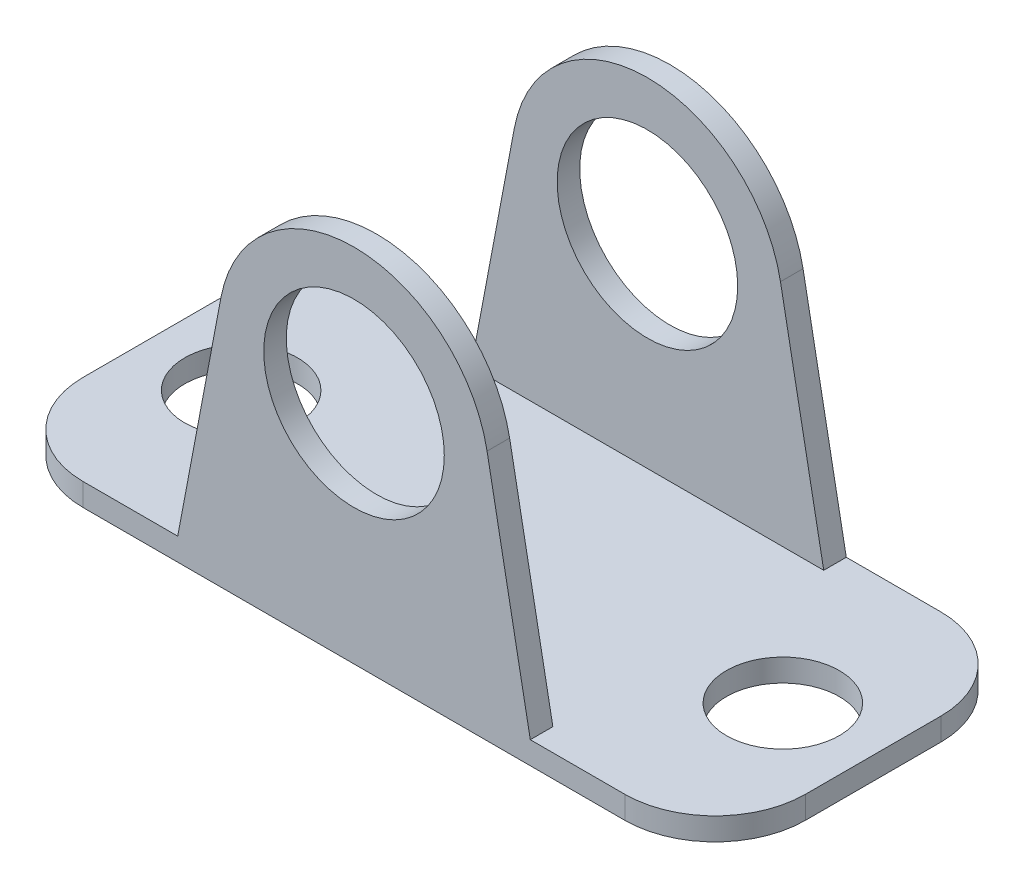
ISO-10303-21;
HEADER;
FILE_DESCRIPTION(('STEP AP214'),'2;1');
FILE_NAME('part.step','',(''),(''),'','','');
FILE_SCHEMA(('AUTOMOTIVE_DESIGN { 1 0 10303 214 1 1 1 1 }'));
ENDSEC;
DATA;
#1=APPLICATION_CONTEXT('core data for automotive mechanical design processes');
#2=APPLICATION_PROTOCOL_DEFINITION('international standard','automotive_design',2000,#1);
#3=PRODUCT_CONTEXT('',#1,'mechanical');
#4=PRODUCT('Part','Part','',(#3));
#5=PRODUCT_RELATED_PRODUCT_CATEGORY('part','',(#4));
#6=PRODUCT_DEFINITION_FORMATION('','',#4);
#7=PRODUCT_DEFINITION_CONTEXT('part definition',#1,'design');
#8=PRODUCT_DEFINITION('design','',#6,#7);
#9=PRODUCT_DEFINITION_SHAPE('','',#8);
#10=(LENGTH_UNIT() NAMED_UNIT(*) SI_UNIT(.MILLI.,.METRE.));
#11=(NAMED_UNIT(*) PLANE_ANGLE_UNIT() SI_UNIT($,.RADIAN.));
#12=(NAMED_UNIT(*) SI_UNIT($,.STERADIAN.) SOLID_ANGLE_UNIT());
#13=UNCERTAINTY_MEASURE_WITH_UNIT(LENGTH_MEASURE(1.E-05),#10,'distance_accuracy_value','');
#14=(GEOMETRIC_REPRESENTATION_CONTEXT(3) GLOBAL_UNCERTAINTY_ASSIGNED_CONTEXT((#13)) GLOBAL_UNIT_ASSIGNED_CONTEXT((#10,
#11,#12)) REPRESENTATION_CONTEXT('',''));
#15=CARTESIAN_POINT('',(0.,0.,0.));
#16=DIRECTION('',(0.,0.,1.));
#17=DIRECTION('',(1.,0.,0.));
#18=AXIS2_PLACEMENT_3D('',#15,#16,#17);
#19=CARTESIAN_POINT('',(0.,0.5,-3.));
#20=DIRECTION('',(0.,-1.,0.));
#21=DIRECTION('',(0.,0.,-1.));
#22=AXIS2_PLACEMENT_3D('',#19,#20,#21);
#23=PLANE('',#22);
#24=CARTESIAN_POINT('',(-6.,0.5,-3.));
#25=DIRECTION('',(0.,1.,0.));
#26=DIRECTION('',(0.,0.,1.));
#27=AXIS2_PLACEMENT_3D('',#24,#25,#26);
#28=CIRCLE('',#27,1.25);
#29=CARTESIAN_POINT('',(-6.,0.5,-1.75));
#30=VERTEX_POINT('',#29);
#31=EDGE_CURVE('E603',#30,#30,#28,.T.);
#32=ORIENTED_EDGE('',*,*,#31,.F.);
#33=EDGE_LOOP('',(#32));
#34=FACE_BOUND('',#33,.T.);
#35=DIRECTION('',(0.,0.,1.));
#36=VECTOR('',#35,1.);
#37=CARTESIAN_POINT('',(8.,0.5,0.5));
#38=LINE('',#37,#36);
#39=CARTESIAN_POINT('',(8.,0.5,-4.5));
#40=VERTEX_POINT('',#39);
#41=CARTESIAN_POINT('',(8.,0.5,-1.5));
#42=VERTEX_POINT('',#41);
#43=EDGE_CURVE('E295',#40,#42,#38,.T.);
#44=ORIENTED_EDGE('',*,*,#43,.F.);
#45=CARTESIAN_POINT('',(6.,0.5,-4.5));
#46=DIRECTION('',(0.,-1.,0.));
#47=DIRECTION('',(0.,0.,-1.));
#48=AXIS2_PLACEMENT_3D('',#45,#46,#47);
#49=CIRCLE('',#48,2.);
#50=CARTESIAN_POINT('',(6.,0.5,-6.5));
#51=VERTEX_POINT('',#50);
#52=EDGE_CURVE('E255',#40,#51,#49,.F.);
#53=ORIENTED_EDGE('',*,*,#52,.T.);
#54=DIRECTION('',(-1.,0.,0.));
#55=VECTOR('',#54,1.);
#56=CARTESIAN_POINT('',(8.,0.5,-6.5));
#57=LINE('',#56,#55);
#58=CARTESIAN_POINT('',(3.90533008588991,0.5,-6.5));
#59=VERTEX_POINT('',#58);
#60=EDGE_CURVE('E182',#51,#59,#57,.T.);
#61=ORIENTED_EDGE('',*,*,#60,.T.);
#62=DIRECTION('',(0.,0.,1.));
#63=VECTOR('',#62,1.);
#64=CARTESIAN_POINT('',(3.90533008588991,0.5,0.5));
#65=LINE('',#64,#63);
#66=CARTESIAN_POINT('',(3.90533008588991,0.5,-6.));
#67=VERTEX_POINT('',#66);
#68=EDGE_CURVE('E179',#59,#67,#65,.T.);
#69=ORIENTED_EDGE('',*,*,#68,.T.);
#70=DIRECTION('',(1.,0.,0.));
#71=VECTOR('',#70,1.);
#72=CARTESIAN_POINT('',(0.,0.5,-6.));
#73=LINE('',#72,#71);
#74=CARTESIAN_POINT('',(-3.90533008588991,0.5,-6.));
#75=VERTEX_POINT('',#74);
#76=EDGE_CURVE('E185',#75,#67,#73,.T.);
#77=ORIENTED_EDGE('',*,*,#76,.F.);
#78=DIRECTION('',(0.,0.,1.));
#79=VECTOR('',#78,1.);
#80=CARTESIAN_POINT('',(-3.90533008588991,0.5,0.5));
#81=LINE('',#80,#79);
#82=CARTESIAN_POINT('',(-3.90533008588991,0.5,-6.5));
#83=VERTEX_POINT('',#82);
#84=EDGE_CURVE('E176',#83,#75,#81,.T.);
#85=ORIENTED_EDGE('',*,*,#84,.F.);
#86=CARTESIAN_POINT('',(-6.,0.5,-6.5));
#87=VERTEX_POINT('',#86);
#88=EDGE_CURVE('E158',#83,#87,#57,.T.);
#89=ORIENTED_EDGE('',*,*,#88,.T.);
#90=CARTESIAN_POINT('',(-6.,0.5,-4.5));
#91=DIRECTION('',(0.,-1.,0.));
#92=DIRECTION('',(0.,0.,-1.));
#93=AXIS2_PLACEMENT_3D('',#90,#91,#92);
#94=CIRCLE('',#93,2.);
#95=CARTESIAN_POINT('',(-8.,0.5,-4.5));
#96=VERTEX_POINT('',#95);
#97=EDGE_CURVE('E251',#87,#96,#94,.F.);
#98=ORIENTED_EDGE('',*,*,#97,.T.);
#99=DIRECTION('',(0.,0.,1.));
#100=VECTOR('',#99,1.);
#101=CARTESIAN_POINT('',(-8.,0.5,0.5));
#102=LINE('',#101,#100);
#103=CARTESIAN_POINT('',(-8.,0.5,-1.5));
#104=VERTEX_POINT('',#103);
#105=EDGE_CURVE('E275',#96,#104,#102,.T.);
#106=ORIENTED_EDGE('',*,*,#105,.T.);
#107=CARTESIAN_POINT('',(-6.,0.5,-1.5));
#108=DIRECTION('',(0.,-1.,0.));
#109=DIRECTION('',(0.,0.,-1.));
#110=AXIS2_PLACEMENT_3D('',#107,#108,#109);
#111=CIRCLE('',#110,2.);
#112=CARTESIAN_POINT('',(-6.,0.5,0.5));
#113=VERTEX_POINT('',#112);
#114=EDGE_CURVE('E249',#104,#113,#111,.F.);
#115=ORIENTED_EDGE('',*,*,#114,.T.);
#116=DIRECTION('',(-1.,0.,0.));
#117=VECTOR('',#116,1.);
#118=CARTESIAN_POINT('',(8.,0.5,0.5));
#119=LINE('',#118,#117);
#120=CARTESIAN_POINT('',(-3.90533008588991,0.5,0.5));
#121=VERTEX_POINT('',#120);
#122=EDGE_CURVE('E159',#121,#113,#119,.T.);
#123=ORIENTED_EDGE('',*,*,#122,.F.);
#124=CARTESIAN_POINT('',(-3.90533008588991,0.5,0.));
#125=VERTEX_POINT('',#124);
#126=EDGE_CURVE('E177',#125,#121,#81,.T.);
#127=ORIENTED_EDGE('',*,*,#126,.F.);
#128=DIRECTION('',(1.,0.,0.));
#129=VECTOR('',#128,1.);
#130=CARTESIAN_POINT('',(0.,0.5,0.));
#131=LINE('',#130,#129);
#132=CARTESIAN_POINT('',(3.90533008588991,0.5,0.));
#133=VERTEX_POINT('',#132);
#134=EDGE_CURVE('E175',#125,#133,#131,.T.);
#135=ORIENTED_EDGE('',*,*,#134,.T.);
#136=CARTESIAN_POINT('',(3.90533008588991,0.5,0.5));
#137=VERTEX_POINT('',#136);
#138=EDGE_CURVE('E164',#133,#137,#65,.T.);
#139=ORIENTED_EDGE('',*,*,#138,.T.);
#140=CARTESIAN_POINT('',(6.,0.5,0.5));
#141=VERTEX_POINT('',#140);
#142=EDGE_CURVE('E145',#141,#137,#119,.T.);
#143=ORIENTED_EDGE('',*,*,#142,.F.);
#144=CARTESIAN_POINT('',(6.,0.5,-1.5));
#145=DIRECTION('',(0.,-1.,0.));
#146=DIRECTION('',(0.,0.,-1.));
#147=AXIS2_PLACEMENT_3D('',#144,#145,#146);
#148=CIRCLE('',#147,2.);
#149=EDGE_CURVE('E253',#141,#42,#148,.F.);
#150=ORIENTED_EDGE('',*,*,#149,.T.);
#151=EDGE_LOOP('',(#44,#53,#61,#69,#77,#85,#89,#98,#106,#115,#123,#127,#135,#139,#143,#150));
#152=FACE_BOUND('',#151,.T.);
#153=CARTESIAN_POINT('',(6.,0.5,-3.));
#154=DIRECTION('',(0.,1.,0.));
#155=DIRECTION('',(0.,0.,1.));
#156=AXIS2_PLACEMENT_3D('',#153,#154,#155);
#157=CIRCLE('',#156,1.25);
#158=CARTESIAN_POINT('',(6.,0.5,-1.75));
#159=VERTEX_POINT('',#158);
#160=EDGE_CURVE('E599',#159,#159,#157,.T.);
#161=ORIENTED_EDGE('',*,*,#160,.F.);
#162=EDGE_LOOP('',(#161));
#163=FACE_BOUND('',#162,.T.);
#164=ADVANCED_FACE('F34',(#34,#152,#163),#23,.F.);
#165=CARTESIAN_POINT('',(3.86156456856415,0.731147972073065,0.5));
#166=DIRECTION('',(-0.982543201157607,-0.186034560926086,0.));
#167=DIRECTION('',(0.186034560926086,-0.982543201157608,0.));
#168=AXIS2_PLACEMENT_3D('',#165,#166,#167);
#169=PLANE('',#168);
#170=ORIENTED_EDGE('',*,*,#68,.F.);
#171=DIRECTION('',(-0.186034560926086,0.982543201157608,0.));
#172=VECTOR('',#171,1.);
#173=CARTESIAN_POINT('',(3.86156456856415,0.731147972073065,-6.5));
#174=LINE('',#173,#172);
#175=CARTESIAN_POINT('',(2.94762960347282,5.55810368277826,-6.5));
#176=VERTEX_POINT('',#175);
#177=EDGE_CURVE('E200',#59,#176,#174,.T.);
#178=ORIENTED_EDGE('',*,*,#177,.T.);
#179=DIRECTION('',(0.,0.,1.));
#180=VECTOR('',#179,1.);
#181=CARTESIAN_POINT('',(2.94762960347282,5.55810368277826,-6.5));
#182=LINE('',#181,#180);
#183=CARTESIAN_POINT('',(2.94762960347282,5.55810368277826,-6.));
#184=VERTEX_POINT('',#183);
#185=EDGE_CURVE('E219',#176,#184,#182,.T.);
#186=ORIENTED_EDGE('',*,*,#185,.T.);
#187=DIRECTION('',(-0.186034560926086,0.982543201157608,0.));
#188=VECTOR('',#187,1.);
#189=CARTESIAN_POINT('',(3.86156456856415,0.731147972073065,-6.));
#190=LINE('',#189,#188);
#191=EDGE_CURVE('E194',#67,#184,#190,.T.);
#192=ORIENTED_EDGE('',*,*,#191,.F.);
#193=EDGE_LOOP('',(#170,#178,#186,#192));
#194=FACE_BOUND('',#193,.T.);
#195=ADVANCED_FACE('F321',(#194),#169,.F.);
#196=ORIENTED_EDGE('',*,*,#138,.F.);
#197=DIRECTION('',(-0.186034560926086,0.982543201157608,0.));
#198=VECTOR('',#197,1.);
#199=CARTESIAN_POINT('',(3.86156456856415,0.731147972073065,0.));
#200=LINE('',#199,#198);
#201=CARTESIAN_POINT('',(2.94762960347282,5.55810368277826,0.));
#202=VERTEX_POINT('',#201);
#203=EDGE_CURVE('E234',#133,#202,#200,.T.);
#204=ORIENTED_EDGE('',*,*,#203,.T.);
#205=DIRECTION('',(0.,0.,-1.));
#206=VECTOR('',#205,1.);
#207=CARTESIAN_POINT('',(2.94762960347282,5.55810368277826,0.5));
#208=LINE('',#207,#206);
#209=CARTESIAN_POINT('',(2.94762960347282,5.55810368277826,0.5));
#210=VERTEX_POINT('',#209);
#211=EDGE_CURVE('E167',#210,#202,#208,.T.);
#212=ORIENTED_EDGE('',*,*,#211,.F.);
#213=DIRECTION('',(-0.186034560926086,0.982543201157608,0.));
#214=VECTOR('',#213,1.);
#215=CARTESIAN_POINT('',(3.86156456856415,0.731147972073065,0.5));
#216=LINE('',#215,#214);
#217=EDGE_CURVE('E151',#137,#210,#216,.T.);
#218=ORIENTED_EDGE('',*,*,#217,.F.);
#219=EDGE_LOOP('',(#196,#204,#212,#218));
#220=FACE_BOUND('',#219,.T.);
#221=ADVANCED_FACE('F163',(#220),#169,.F.);
#222=CARTESIAN_POINT('',(-3.86156456856415,0.731147972073065,0.5));
#223=DIRECTION('',(-0.982543201157607,0.186034560926086,0.));
#224=DIRECTION('',(-0.186034560926086,-0.982543201157608,0.));
#225=AXIS2_PLACEMENT_3D('',#222,#223,#224);
#226=PLANE('',#225);
#227=DIRECTION('',(0.186034560926086,0.982543201157608,0.));
#228=VECTOR('',#227,1.);
#229=CARTESIAN_POINT('',(-3.86156456856415,0.731147972073065,-6.5));
#230=LINE('',#229,#228);
#231=CARTESIAN_POINT('',(-2.94762960347282,5.55810368277826,-6.5));
#232=VERTEX_POINT('',#231);
#233=EDGE_CURVE('E206',#83,#232,#230,.T.);
#234=ORIENTED_EDGE('',*,*,#233,.F.);
#235=ORIENTED_EDGE('',*,*,#84,.T.);
#236=DIRECTION('',(0.186034560926086,0.982543201157608,0.));
#237=VECTOR('',#236,1.);
#238=CARTESIAN_POINT('',(-3.86156456856415,0.731147972073065,-6.));
#239=LINE('',#238,#237);
#240=CARTESIAN_POINT('',(-2.94762960347282,5.55810368277826,-6.));
#241=VERTEX_POINT('',#240);
#242=EDGE_CURVE('E201',#75,#241,#239,.T.);
#243=ORIENTED_EDGE('',*,*,#242,.T.);
#244=DIRECTION('',(0.,0.,1.));
#245=VECTOR('',#244,1.);
#246=CARTESIAN_POINT('',(-2.94762960347282,5.55810368277826,-6.5));
#247=LINE('',#246,#245);
#248=EDGE_CURVE('E210',#232,#241,#247,.T.);
#249=ORIENTED_EDGE('',*,*,#248,.F.);
#250=EDGE_LOOP('',(#234,#235,#243,#249));
#251=FACE_BOUND('',#250,.T.);
#252=ADVANCED_FACE('F313',(#251),#226,.T.);
#253=DIRECTION('',(0.186034560926086,0.982543201157608,0.));
#254=VECTOR('',#253,1.);
#255=CARTESIAN_POINT('',(-3.86156456856415,0.731147972073065,0.));
#256=LINE('',#255,#254);
#257=CARTESIAN_POINT('',(-2.94762960347282,5.55810368277826,0.));
#258=VERTEX_POINT('',#257);
#259=EDGE_CURVE('E224',#125,#258,#256,.T.);
#260=ORIENTED_EDGE('',*,*,#259,.F.);
#261=ORIENTED_EDGE('',*,*,#126,.T.);
#262=DIRECTION('',(0.186034560926086,0.982543201157608,0.));
#263=VECTOR('',#262,1.);
#264=CARTESIAN_POINT('',(-3.86156456856415,0.731147972073065,0.5));
#265=LINE('',#264,#263);
#266=CARTESIAN_POINT('',(-2.94762960347282,5.55810368277826,0.5));
#267=VERTEX_POINT('',#266);
#268=EDGE_CURVE('E227',#121,#267,#265,.T.);
#269=ORIENTED_EDGE('',*,*,#268,.T.);
#270=DIRECTION('',(0.,0.,-1.));
#271=VECTOR('',#270,1.);
#272=CARTESIAN_POINT('',(-2.94762960347282,5.55810368277826,0.5));
#273=LINE('',#272,#271);
#274=EDGE_CURVE('E231',#267,#258,#273,.T.);
#275=ORIENTED_EDGE('',*,*,#274,.T.);
#276=EDGE_LOOP('',(#260,#261,#269,#275));
#277=FACE_BOUND('',#276,.T.);
#278=ADVANCED_FACE('F349',(#277),#226,.T.);
#279=CARTESIAN_POINT('',(0.,0.,0.));
#280=DIRECTION('',(0.,0.,1.));
#281=DIRECTION('',(1.,0.,0.));
#282=AXIS2_PLACEMENT_3D('',#279,#280,#281);
#283=PLANE('',#282);
#284=CARTESIAN_POINT('',(0.,5.,0.));
#285=DIRECTION('',(0.,0.,1.));
#286=DIRECTION('',(1.,0.,0.));
#287=AXIS2_PLACEMENT_3D('',#284,#285,#286);
#288=CIRCLE('',#287,2.);
#289=CARTESIAN_POINT('',(2.,5.,0.));
#290=VERTEX_POINT('',#289);
#291=EDGE_CURVE('E222',#290,#290,#288,.T.);
#292=ORIENTED_EDGE('',*,*,#291,.T.);
#293=EDGE_LOOP('',(#292));
#294=FACE_BOUND('',#293,.T.);
#295=ORIENTED_EDGE('',*,*,#134,.F.);
#296=ORIENTED_EDGE('',*,*,#259,.T.);
#297=CARTESIAN_POINT('',(0.,5.,0.));
#298=DIRECTION('',(0.,0.,1.));
#299=DIRECTION('',(1.,0.,0.));
#300=AXIS2_PLACEMENT_3D('',#297,#298,#299);
#301=CIRCLE('',#300,3.);
#302=EDGE_CURVE('E236',#202,#258,#301,.T.);
#303=ORIENTED_EDGE('',*,*,#302,.F.);
#304=ORIENTED_EDGE('',*,*,#203,.F.);
#305=EDGE_LOOP('',(#295,#296,#303,#304));
#306=FACE_BOUND('',#305,.T.);
#307=ADVANCED_FACE('F345',(#294,#306),#283,.F.);
#308=CARTESIAN_POINT('',(0.,5.,0.5));
#309=DIRECTION('',(0.,0.,-1.));
#310=DIRECTION('',(-1.,0.,0.));
#311=AXIS2_PLACEMENT_3D('',#308,#309,#310);
#312=CYLINDRICAL_SURFACE('',#311,3.);
#313=ORIENTED_EDGE('',*,*,#302,.T.);
#314=ORIENTED_EDGE('',*,*,#274,.F.);
#315=CARTESIAN_POINT('',(0.,5.,0.5));
#316=DIRECTION('',(0.,0.,1.));
#317=DIRECTION('',(1.,0.,0.));
#318=AXIS2_PLACEMENT_3D('',#315,#316,#317);
#319=CIRCLE('',#318,3.);
#320=EDGE_CURVE('E168',#210,#267,#319,.T.);
#321=ORIENTED_EDGE('',*,*,#320,.F.);
#322=ORIENTED_EDGE('',*,*,#211,.T.);
#323=EDGE_LOOP('',(#313,#314,#321,#322));
#324=FACE_BOUND('',#323,.T.);
#325=ADVANCED_FACE('F348',(#324),#312,.T.);
#326=CARTESIAN_POINT('',(0.,5.,0.5));
#327=DIRECTION('',(0.,0.,-1.));
#328=DIRECTION('',(-1.,0.,0.));
#329=AXIS2_PLACEMENT_3D('',#326,#327,#328);
#330=CYLINDRICAL_SURFACE('',#329,2.);
#331=CARTESIAN_POINT('',(0.,5.,0.5));
#332=DIRECTION('',(0.,0.,1.));
#333=DIRECTION('',(1.,0.,0.));
#334=AXIS2_PLACEMENT_3D('',#331,#332,#333);
#335=CIRCLE('',#334,2.);
#336=CARTESIAN_POINT('',(2.,5.,0.5));
#337=VERTEX_POINT('',#336);
#338=EDGE_CURVE('E169',#337,#337,#335,.T.);
#339=ORIENTED_EDGE('',*,*,#338,.T.);
#340=EDGE_LOOP('',(#339));
#341=FACE_BOUND('',#340,.T.);
#342=ORIENTED_EDGE('',*,*,#291,.F.);
#343=EDGE_LOOP('',(#342));
#344=FACE_BOUND('',#343,.T.);
#345=ADVANCED_FACE('F353',(#341,#344),#330,.F.);
#346=CARTESIAN_POINT('',(0.,0.,0.5));
#347=DIRECTION('',(0.,1.,0.));
#348=DIRECTION('',(0.,0.,1.));
#349=AXIS2_PLACEMENT_3D('',#346,#347,#348);
#350=PLANE('',#349);
#351=CARTESIAN_POINT('',(-6.,0.,-3.));
#352=DIRECTION('',(0.,1.,0.));
#353=DIRECTION('',(0.,0.,1.));
#354=AXIS2_PLACEMENT_3D('',#351,#352,#353);
#355=CIRCLE('',#354,1.25);
#356=CARTESIAN_POINT('',(-6.,0.,-1.75));
#357=VERTEX_POINT('',#356);
#358=EDGE_CURVE('E600',#357,#357,#355,.T.);
#359=ORIENTED_EDGE('',*,*,#358,.T.);
#360=EDGE_LOOP('',(#359));
#361=FACE_BOUND('',#360,.T.);
#362=CARTESIAN_POINT('',(6.,0.,-3.));
#363=DIRECTION('',(0.,1.,0.));
#364=DIRECTION('',(0.,0.,1.));
#365=AXIS2_PLACEMENT_3D('',#362,#363,#364);
#366=CIRCLE('',#365,1.25);
#367=CARTESIAN_POINT('',(6.,0.,-1.75));
#368=VERTEX_POINT('',#367);
#369=EDGE_CURVE('E300',#368,#368,#366,.T.);
#370=ORIENTED_EDGE('',*,*,#369,.T.);
#371=EDGE_LOOP('',(#370));
#372=FACE_BOUND('',#371,.T.);
#373=DIRECTION('',(1.,0.,0.));
#374=VECTOR('',#373,1.);
#375=CARTESIAN_POINT('',(0.,0.,-6.5));
#376=LINE('',#375,#374);
#377=CARTESIAN_POINT('',(-6.,0.,-6.5));
#378=VERTEX_POINT('',#377);
#379=CARTESIAN_POINT('',(6.,0.,-6.5));
#380=VERTEX_POINT('',#379);
#381=EDGE_CURVE('E208',#378,#380,#376,.T.);
#382=ORIENTED_EDGE('',*,*,#381,.T.);
#383=CARTESIAN_POINT('',(6.,0.,-4.5));
#384=DIRECTION('',(0.,1.,0.));
#385=DIRECTION('',(0.,0.,1.));
#386=AXIS2_PLACEMENT_3D('',#383,#384,#385);
#387=CIRCLE('',#386,2.);
#388=CARTESIAN_POINT('',(8.,0.,-4.5));
#389=VERTEX_POINT('',#388);
#390=EDGE_CURVE('E267',#380,#389,#387,.F.);
#391=ORIENTED_EDGE('',*,*,#390,.T.);
#392=DIRECTION('',(0.,0.,-1.));
#393=VECTOR('',#392,1.);
#394=CARTESIAN_POINT('',(8.,0.,0.5));
#395=LINE('',#394,#393);
#396=CARTESIAN_POINT('',(8.,0.,-1.5));
#397=VERTEX_POINT('',#396);
#398=EDGE_CURVE('E281',#397,#389,#395,.T.);
#399=ORIENTED_EDGE('',*,*,#398,.F.);
#400=CARTESIAN_POINT('',(6.,0.,-1.5));
#401=DIRECTION('',(0.,1.,0.));
#402=DIRECTION('',(0.,0.,1.));
#403=AXIS2_PLACEMENT_3D('',#400,#401,#402);
#404=CIRCLE('',#403,2.);
#405=CARTESIAN_POINT('',(6.,0.,0.5));
#406=VERTEX_POINT('',#405);
#407=EDGE_CURVE('E265',#397,#406,#404,.F.);
#408=ORIENTED_EDGE('',*,*,#407,.T.);
#409=DIRECTION('',(1.,0.,0.));
#410=VECTOR('',#409,1.);
#411=CARTESIAN_POINT('',(0.,0.,0.5));
#412=LINE('',#411,#410);
#413=CARTESIAN_POINT('',(-6.,0.,0.5));
#414=VERTEX_POINT('',#413);
#415=EDGE_CURVE('E229',#414,#406,#412,.T.);
#416=ORIENTED_EDGE('',*,*,#415,.F.);
#417=CARTESIAN_POINT('',(-6.,0.,-1.5));
#418=DIRECTION('',(0.,1.,0.));
#419=DIRECTION('',(0.,0.,1.));
#420=AXIS2_PLACEMENT_3D('',#417,#418,#419);
#421=CIRCLE('',#420,2.);
#422=CARTESIAN_POINT('',(-8.,0.,-1.5));
#423=VERTEX_POINT('',#422);
#424=EDGE_CURVE('E54',#414,#423,#421,.F.);
#425=ORIENTED_EDGE('',*,*,#424,.T.);
#426=DIRECTION('',(0.,0.,-1.));
#427=VECTOR('',#426,1.);
#428=CARTESIAN_POINT('',(-8.,0.,0.5));
#429=LINE('',#428,#427);
#430=CARTESIAN_POINT('',(-8.,0.,-4.5));
#431=VERTEX_POINT('',#430);
#432=EDGE_CURVE('E276',#423,#431,#429,.T.);
#433=ORIENTED_EDGE('',*,*,#432,.T.);
#434=CARTESIAN_POINT('',(-6.,0.,-4.5));
#435=DIRECTION('',(0.,1.,0.));
#436=DIRECTION('',(0.,0.,1.));
#437=AXIS2_PLACEMENT_3D('',#434,#435,#436);
#438=CIRCLE('',#437,2.);
#439=EDGE_CURVE('E263',#431,#378,#438,.F.);
#440=ORIENTED_EDGE('',*,*,#439,.T.);
#441=EDGE_LOOP('',(#382,#391,#399,#408,#416,#425,#433,#440));
#442=FACE_BOUND('',#441,.T.);
#443=ADVANCED_FACE('F285',(#361,#372,#442),#350,.F.);
#444=CARTESIAN_POINT('',(0.,0.,0.5));
#445=DIRECTION('',(0.,0.,1.));
#446=DIRECTION('',(1.,0.,0.));
#447=AXIS2_PLACEMENT_3D('',#444,#445,#446);
#448=PLANE('',#447);
#449=ORIENTED_EDGE('',*,*,#415,.T.);
#450=DIRECTION('',(0.,-1.,0.));
#451=VECTOR('',#450,1.);
#452=CARTESIAN_POINT('',(6.,0.,0.5));
#453=LINE('',#452,#451);
#454=EDGE_CURVE('E154',#406,#141,#453,.F.);
#455=ORIENTED_EDGE('',*,*,#454,.T.);
#456=ORIENTED_EDGE('',*,*,#142,.T.);
#457=ORIENTED_EDGE('',*,*,#217,.T.);
#458=ORIENTED_EDGE('',*,*,#320,.T.);
#459=ORIENTED_EDGE('',*,*,#268,.F.);
#460=ORIENTED_EDGE('',*,*,#122,.T.);
#461=DIRECTION('',(0.,-1.,0.));
#462=VECTOR('',#461,1.);
#463=CARTESIAN_POINT('',(-6.,0.,0.5));
#464=LINE('',#463,#462);
#465=EDGE_CURVE('E269',#113,#414,#464,.T.);
#466=ORIENTED_EDGE('',*,*,#465,.T.);
#467=EDGE_LOOP('',(#449,#455,#456,#457,#458,#459,#460,#466));
#468=FACE_BOUND('',#467,.T.);
#469=ORIENTED_EDGE('',*,*,#338,.F.);
#470=EDGE_LOOP('',(#469));
#471=FACE_BOUND('',#470,.T.);
#472=ADVANCED_FACE('F148',(#468,#471),#448,.T.);
#473=CARTESIAN_POINT('',(0.,0.,-6.));
#474=DIRECTION('',(0.,0.,-1.));
#475=DIRECTION('',(1.,0.,0.));
#476=AXIS2_PLACEMENT_3D('',#473,#474,#475);
#477=PLANE('',#476);
#478=CARTESIAN_POINT('',(0.,5.,-6.));
#479=DIRECTION('',(0.,0.,1.));
#480=DIRECTION('',(1.,0.,0.));
#481=AXIS2_PLACEMENT_3D('',#478,#479,#480);
#482=CIRCLE('',#481,2.);
#483=CARTESIAN_POINT('',(2.,5.,-6.));
#484=VERTEX_POINT('',#483);
#485=EDGE_CURVE('E189',#484,#484,#482,.T.);
#486=ORIENTED_EDGE('',*,*,#485,.F.);
#487=EDGE_LOOP('',(#486));
#488=FACE_BOUND('',#487,.T.);
#489=ORIENTED_EDGE('',*,*,#76,.T.);
#490=ORIENTED_EDGE('',*,*,#191,.T.);
#491=CARTESIAN_POINT('',(0.,5.,-6.));
#492=DIRECTION('',(0.,0.,1.));
#493=DIRECTION('',(1.,0.,0.));
#494=AXIS2_PLACEMENT_3D('',#491,#492,#493);
#495=CIRCLE('',#494,3.);
#496=EDGE_CURVE('E213',#184,#241,#495,.T.);
#497=ORIENTED_EDGE('',*,*,#496,.T.);
#498=ORIENTED_EDGE('',*,*,#242,.F.);
#499=EDGE_LOOP('',(#489,#490,#497,#498));
#500=FACE_BOUND('',#499,.T.);
#501=ADVANCED_FACE('F322',(#488,#500),#477,.F.);
#502=CARTESIAN_POINT('',(0.,5.,-6.5));
#503=DIRECTION('',(0.,0.,1.));
#504=DIRECTION('',(-1.,0.,0.));
#505=AXIS2_PLACEMENT_3D('',#502,#503,#504);
#506=CYLINDRICAL_SURFACE('',#505,3.);
#507=ORIENTED_EDGE('',*,*,#496,.F.);
#508=ORIENTED_EDGE('',*,*,#185,.F.);
#509=CARTESIAN_POINT('',(0.,5.,-6.5));
#510=DIRECTION('',(0.,0.,1.));
#511=DIRECTION('',(1.,0.,0.));
#512=AXIS2_PLACEMENT_3D('',#509,#510,#511);
#513=CIRCLE('',#512,3.);
#514=EDGE_CURVE('E203',#176,#232,#513,.T.);
#515=ORIENTED_EDGE('',*,*,#514,.T.);
#516=ORIENTED_EDGE('',*,*,#248,.T.);
#517=EDGE_LOOP('',(#507,#508,#515,#516));
#518=FACE_BOUND('',#517,.T.);
#519=ADVANCED_FACE('F317',(#518),#506,.T.);
#520=CARTESIAN_POINT('',(0.,5.,-6.5));
#521=DIRECTION('',(0.,0.,1.));
#522=DIRECTION('',(-1.,0.,0.));
#523=AXIS2_PLACEMENT_3D('',#520,#521,#522);
#524=CYLINDRICAL_SURFACE('',#523,2.);
#525=CARTESIAN_POINT('',(0.,5.,-6.5));
#526=DIRECTION('',(0.,0.,1.));
#527=DIRECTION('',(1.,0.,0.));
#528=AXIS2_PLACEMENT_3D('',#525,#526,#527);
#529=CIRCLE('',#528,2.);
#530=CARTESIAN_POINT('',(2.,5.,-6.5));
#531=VERTEX_POINT('',#530);
#532=EDGE_CURVE('E197',#531,#531,#529,.T.);
#533=ORIENTED_EDGE('',*,*,#532,.F.);
#534=EDGE_LOOP('',(#533));
#535=FACE_BOUND('',#534,.T.);
#536=ORIENTED_EDGE('',*,*,#485,.T.);
#537=EDGE_LOOP('',(#536));
#538=FACE_BOUND('',#537,.T.);
#539=ADVANCED_FACE('F330',(#535,#538),#524,.F.);
#540=CARTESIAN_POINT('',(0.,0.,-6.5));
#541=DIRECTION('',(0.,0.,-1.));
#542=DIRECTION('',(1.,0.,0.));
#543=AXIS2_PLACEMENT_3D('',#540,#541,#542);
#544=PLANE('',#543);
#545=ORIENTED_EDGE('',*,*,#60,.F.);
#546=DIRECTION('',(0.,1.,0.));
#547=VECTOR('',#546,1.);
#548=CARTESIAN_POINT('',(6.,0.,-6.5));
#549=LINE('',#548,#547);
#550=EDGE_CURVE('E260',#51,#380,#549,.F.);
#551=ORIENTED_EDGE('',*,*,#550,.T.);
#552=ORIENTED_EDGE('',*,*,#381,.F.);
#553=DIRECTION('',(0.,1.,0.));
#554=VECTOR('',#553,1.);
#555=CARTESIAN_POINT('',(-6.,0.5,-6.5));
#556=LINE('',#555,#554);
#557=EDGE_CURVE('E257',#378,#87,#556,.T.);
#558=ORIENTED_EDGE('',*,*,#557,.T.);
#559=ORIENTED_EDGE('',*,*,#88,.F.);
#560=ORIENTED_EDGE('',*,*,#233,.T.);
#561=ORIENTED_EDGE('',*,*,#514,.F.);
#562=ORIENTED_EDGE('',*,*,#177,.F.);
#563=EDGE_LOOP('',(#545,#551,#552,#558,#559,#560,#561,#562));
#564=FACE_BOUND('',#563,.T.);
#565=ORIENTED_EDGE('',*,*,#532,.T.);
#566=EDGE_LOOP('',(#565));
#567=FACE_BOUND('',#566,.T.);
#568=ADVANCED_FACE('F306',(#564,#567),#544,.T.);
#569=CARTESIAN_POINT('',(-8.,0.,0.));
#570=DIRECTION('',(1.,0.,0.));
#571=DIRECTION('',(0.,0.,-1.));
#572=AXIS2_PLACEMENT_3D('',#569,#570,#571);
#573=PLANE('',#572);
#574=ORIENTED_EDGE('',*,*,#105,.F.);
#575=DIRECTION('',(0.,1.,0.));
#576=VECTOR('',#575,1.);
#577=CARTESIAN_POINT('',(-8.,0.,-4.5));
#578=LINE('',#577,#576);
#579=EDGE_CURVE('E11',#96,#431,#578,.F.);
#580=ORIENTED_EDGE('',*,*,#579,.T.);
#581=ORIENTED_EDGE('',*,*,#432,.F.);
#582=DIRECTION('',(0.,-1.,0.));
#583=VECTOR('',#582,1.);
#584=CARTESIAN_POINT('',(-8.,0.5,-1.5));
#585=LINE('',#584,#583);
#586=EDGE_CURVE('E42',#423,#104,#585,.F.);
#587=ORIENTED_EDGE('',*,*,#586,.T.);
#588=EDGE_LOOP('',(#574,#580,#581,#587));
#589=FACE_BOUND('',#588,.T.);
#590=ADVANCED_FACE('F274',(#589),#573,.F.);
#591=CARTESIAN_POINT('',(8.,0.,0.));
#592=DIRECTION('',(1.,0.,0.));
#593=DIRECTION('',(0.,0.,-1.));
#594=AXIS2_PLACEMENT_3D('',#591,#592,#593);
#595=PLANE('',#594);
#596=ORIENTED_EDGE('',*,*,#398,.T.);
#597=DIRECTION('',(0.,1.,0.));
#598=VECTOR('',#597,1.);
#599=CARTESIAN_POINT('',(8.,0.,-4.5));
#600=LINE('',#599,#598);
#601=EDGE_CURVE('E246',#389,#40,#600,.T.);
#602=ORIENTED_EDGE('',*,*,#601,.T.);
#603=ORIENTED_EDGE('',*,*,#43,.T.);
#604=DIRECTION('',(0.,-1.,0.));
#605=VECTOR('',#604,1.);
#606=CARTESIAN_POINT('',(8.,0.,-1.5));
#607=LINE('',#606,#605);
#608=EDGE_CURVE('E243',#42,#397,#607,.T.);
#609=ORIENTED_EDGE('',*,*,#608,.T.);
#610=EDGE_LOOP('',(#596,#602,#603,#609));
#611=FACE_BOUND('',#610,.T.);
#612=ADVANCED_FACE('F293',(#611),#595,.T.);
#613=CARTESIAN_POINT('',(6.,0.5,-3.));
#614=DIRECTION('',(0.,1.,0.));
#615=DIRECTION('',(0.,0.,1.));
#616=AXIS2_PLACEMENT_3D('',#613,#614,#615);
#617=CYLINDRICAL_SURFACE('',#616,1.25);
#618=ORIENTED_EDGE('',*,*,#369,.F.);
#619=EDGE_LOOP('',(#618));
#620=FACE_BOUND('',#619,.T.);
#621=ORIENTED_EDGE('',*,*,#160,.T.);
#622=EDGE_LOOP('',(#621));
#623=FACE_BOUND('',#622,.T.);
#624=ADVANCED_FACE('F406',(#620,#623),#617,.F.);
#625=CARTESIAN_POINT('',(-6.,0.5,-3.));
#626=DIRECTION('',(0.,1.,0.));
#627=DIRECTION('',(0.,0.,1.));
#628=AXIS2_PLACEMENT_3D('',#625,#626,#627);
#629=CYLINDRICAL_SURFACE('',#628,1.25);
#630=ORIENTED_EDGE('',*,*,#358,.F.);
#631=EDGE_LOOP('',(#630));
#632=FACE_BOUND('',#631,.T.);
#633=ORIENTED_EDGE('',*,*,#31,.T.);
#634=EDGE_LOOP('',(#633));
#635=FACE_BOUND('',#634,.T.);
#636=ADVANCED_FACE('F366',(#632,#635),#629,.F.);
#637=CARTESIAN_POINT('',(6.,0.,-4.5));
#638=DIRECTION('',(0.,1.,0.));
#639=DIRECTION('',(0.,0.,1.));
#640=AXIS2_PLACEMENT_3D('',#637,#638,#639);
#641=CYLINDRICAL_SURFACE('',#640,2.);
#642=ORIENTED_EDGE('',*,*,#390,.F.);
#643=ORIENTED_EDGE('',*,*,#550,.F.);
#644=ORIENTED_EDGE('',*,*,#52,.F.);
#645=ORIENTED_EDGE('',*,*,#601,.F.);
#646=EDGE_LOOP('',(#642,#643,#644,#645));
#647=FACE_BOUND('',#646,.T.);
#648=ADVANCED_FACE('F363',(#647),#641,.T.);
#649=CARTESIAN_POINT('',(6.,0.,-1.5));
#650=DIRECTION('',(0.,-1.,0.));
#651=DIRECTION('',(0.,0.,-1.));
#652=AXIS2_PLACEMENT_3D('',#649,#650,#651);
#653=CYLINDRICAL_SURFACE('',#652,2.);
#654=ORIENTED_EDGE('',*,*,#149,.F.);
#655=ORIENTED_EDGE('',*,*,#454,.F.);
#656=ORIENTED_EDGE('',*,*,#407,.F.);
#657=ORIENTED_EDGE('',*,*,#608,.F.);
#658=EDGE_LOOP('',(#654,#655,#656,#657));
#659=FACE_BOUND('',#658,.T.);
#660=ADVANCED_FACE('F290',(#659),#653,.T.);
#661=CARTESIAN_POINT('',(-6.,0.,-4.5));
#662=DIRECTION('',(0.,-1.,0.));
#663=DIRECTION('',(0.,0.,-1.));
#664=AXIS2_PLACEMENT_3D('',#661,#662,#663);
#665=CYLINDRICAL_SURFACE('',#664,2.);
#666=ORIENTED_EDGE('',*,*,#439,.F.);
#667=ORIENTED_EDGE('',*,*,#579,.F.);
#668=ORIENTED_EDGE('',*,*,#97,.F.);
#669=ORIENTED_EDGE('',*,*,#557,.F.);
#670=EDGE_LOOP('',(#666,#667,#668,#669));
#671=FACE_BOUND('',#670,.T.);
#672=ADVANCED_FACE('F369',(#671),#665,.T.);
#673=CARTESIAN_POINT('',(-6.,0.,-1.5));
#674=DIRECTION('',(0.,1.,0.));
#675=DIRECTION('',(0.,0.,1.));
#676=AXIS2_PLACEMENT_3D('',#673,#674,#675);
#677=CYLINDRICAL_SURFACE('',#676,2.);
#678=ORIENTED_EDGE('',*,*,#114,.F.);
#679=ORIENTED_EDGE('',*,*,#586,.F.);
#680=ORIENTED_EDGE('',*,*,#424,.F.);
#681=ORIENTED_EDGE('',*,*,#465,.F.);
#682=EDGE_LOOP('',(#678,#679,#680,#681));
#683=FACE_BOUND('',#682,.T.);
#684=ADVANCED_FACE('F36',(#683),#677,.T.);
#685=CLOSED_SHELL('',(#164,#195,#221,#252,#278,#307,#325,#345,#443,#472,#501,#519,#539,#568,
#590,#612,#624,#636,#648,#660,#672,#684));
#686=MANIFOLD_SOLID_BREP('B2',#685);
#687=ADVANCED_BREP_SHAPE_REPRESENTATION('',(#18,#686),#14);
#688=SHAPE_DEFINITION_REPRESENTATION(#9,#687);
ENDSEC;
END-ISO-10303-21;
